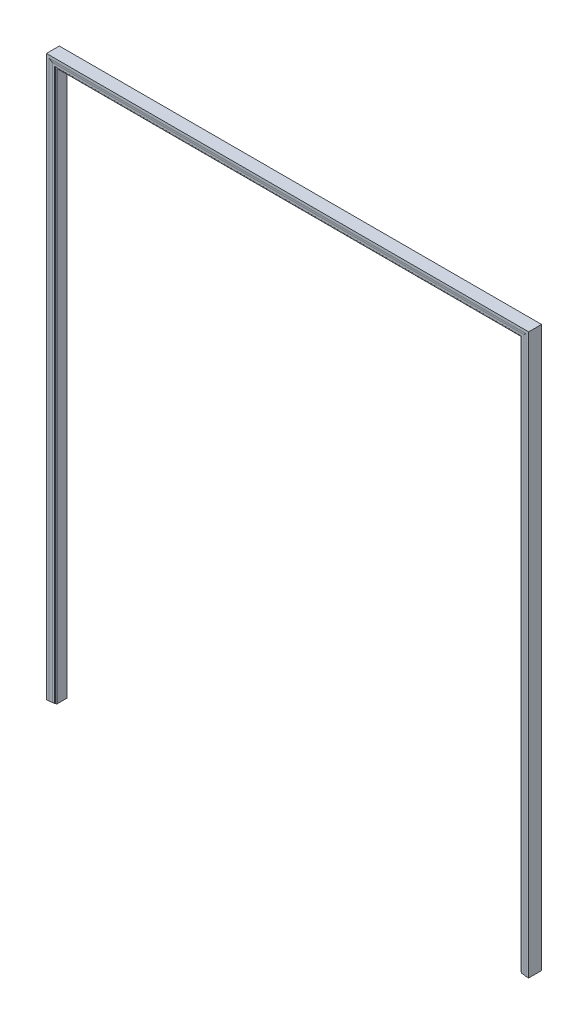
ISO-10303-21;
HEADER;
FILE_DESCRIPTION(('STEP AP214'),'2;1');
FILE_NAME('part.step','',(''),(''),'','','');
FILE_SCHEMA(('AUTOMOTIVE_DESIGN { 1 0 10303 214 1 1 1 1 }'));
ENDSEC;
DATA;
#1=APPLICATION_CONTEXT('core data for automotive mechanical design processes');
#2=APPLICATION_PROTOCOL_DEFINITION('international standard','automotive_design',2000,#1);
#3=PRODUCT_CONTEXT('',#1,'mechanical');
#4=PRODUCT('Part','Part','',(#3));
#5=PRODUCT_RELATED_PRODUCT_CATEGORY('part','',(#4));
#6=PRODUCT_DEFINITION_FORMATION('','',#4);
#7=PRODUCT_DEFINITION_CONTEXT('part definition',#1,'design');
#8=PRODUCT_DEFINITION('design','',#6,#7);
#9=PRODUCT_DEFINITION_SHAPE('','',#8);
#10=(LENGTH_UNIT() NAMED_UNIT(*) SI_UNIT(.MILLI.,.METRE.));
#11=(NAMED_UNIT(*) PLANE_ANGLE_UNIT() SI_UNIT($,.RADIAN.));
#12=(NAMED_UNIT(*) SI_UNIT($,.STERADIAN.) SOLID_ANGLE_UNIT());
#13=UNCERTAINTY_MEASURE_WITH_UNIT(LENGTH_MEASURE(1.E-05),#10,'distance_accuracy_value','');
#14=(GEOMETRIC_REPRESENTATION_CONTEXT(3) GLOBAL_UNCERTAINTY_ASSIGNED_CONTEXT((#13)) GLOBAL_UNIT_ASSIGNED_CONTEXT((#10,
#11,#12)) REPRESENTATION_CONTEXT('',''));
#15=CARTESIAN_POINT('',(0.,0.,0.));
#16=DIRECTION('',(0.,0.,1.));
#17=DIRECTION('',(1.,0.,0.));
#18=AXIS2_PLACEMENT_3D('',#15,#16,#17);
#19=CARTESIAN_POINT('',(0.,0.,-25.));
#20=DIRECTION('',(0.,0.,1.));
#21=DIRECTION('',(1.,0.,0.));
#22=AXIS2_PLACEMENT_3D('',#19,#20,#21);
#23=PLANE('',#22);
#24=DIRECTION('',(0.,1.,0.));
#25=VECTOR('',#24,1.);
#26=CARTESIAN_POINT('',(935.,-1102.5,-25.));
#27=LINE('',#26,#25);
#28=CARTESIAN_POINT('',(935.,-1067.5,-25.));
#29=VERTEX_POINT('',#28);
#30=CARTESIAN_POINT('',(935.,1102.5,-25.));
#31=VERTEX_POINT('',#30);
#32=EDGE_CURVE('E238',#29,#31,#27,.T.);
#33=ORIENTED_EDGE('',*,*,#32,.F.);
#34=DIRECTION('',(1.,0.,0.));
#35=VECTOR('',#34,1.);
#36=CARTESIAN_POINT('',(-935.,-1067.5,-25.));
#37=LINE('',#36,#35);
#38=CARTESIAN_POINT('',(924.5,-1067.5,-25.));
#39=VERTEX_POINT('',#38);
#40=EDGE_CURVE('E224',#39,#29,#37,.T.);
#41=ORIENTED_EDGE('',*,*,#40,.F.);
#42=DIRECTION('',(0.,1.,0.));
#43=VECTOR('',#42,1.);
#44=CARTESIAN_POINT('',(924.5,1080.,-25.));
#45=LINE('',#44,#43);
#46=CARTESIAN_POINT('',(924.5,1092.,-25.));
#47=VERTEX_POINT('',#46);
#48=EDGE_CURVE('E331',#39,#47,#45,.T.);
#49=ORIENTED_EDGE('',*,*,#48,.T.);
#50=DIRECTION('',(-1.,0.,0.));
#51=VECTOR('',#50,1.);
#52=CARTESIAN_POINT('',(-912.5,1092.,-25.));
#53=LINE('',#52,#51);
#54=CARTESIAN_POINT('',(-924.5,1092.,-25.));
#55=VERTEX_POINT('',#54);
#56=EDGE_CURVE('E333',#47,#55,#53,.T.);
#57=ORIENTED_EDGE('',*,*,#56,.T.);
#58=DIRECTION('',(0.,-1.,0.));
#59=VECTOR('',#58,1.);
#60=CARTESIAN_POINT('',(-924.5,-1080.,-25.));
#61=LINE('',#60,#59);
#62=CARTESIAN_POINT('',(-924.5,-1067.5,-25.));
#63=VERTEX_POINT('',#62);
#64=EDGE_CURVE('E320',#55,#63,#61,.T.);
#65=ORIENTED_EDGE('',*,*,#64,.T.);
#66=CARTESIAN_POINT('',(-935.,-1067.5,-25.));
#67=VERTEX_POINT('',#66);
#68=EDGE_CURVE('E64',#67,#63,#37,.T.);
#69=ORIENTED_EDGE('',*,*,#68,.F.);
#70=DIRECTION('',(0.,-1.,0.));
#71=VECTOR('',#70,1.);
#72=CARTESIAN_POINT('',(-935.,-1102.5,-25.));
#73=LINE('',#72,#71);
#74=CARTESIAN_POINT('',(-935.,1102.5,-25.));
#75=VERTEX_POINT('',#74);
#76=EDGE_CURVE('E248',#75,#67,#73,.T.);
#77=ORIENTED_EDGE('',*,*,#76,.F.);
#78=DIRECTION('',(-1.,0.,0.));
#79=VECTOR('',#78,1.);
#80=CARTESIAN_POINT('',(-935.,1102.5,-25.));
#81=LINE('',#80,#79);
#82=EDGE_CURVE('E245',#31,#75,#81,.T.);
#83=ORIENTED_EDGE('',*,*,#82,.F.);
#84=EDGE_LOOP('',(#33,#41,#49,#57,#65,#69,#77,#83));
#85=FACE_BOUND('',#84,.T.);
#86=ADVANCED_FACE('F41',(#85),#23,.F.);
#87=CARTESIAN_POINT('',(-905.,1072.5,-20.));
#88=DIRECTION('',(1.,0.,0.));
#89=DIRECTION('',(0.,0.,-1.));
#90=AXIS2_PLACEMENT_3D('',#87,#88,#89);
#91=PLANE('',#90);
#92=DIRECTION('',(0.,0.,1.));
#93=VECTOR('',#92,1.);
#94=CARTESIAN_POINT('',(-905.,-1067.5,-20.));
#95=LINE('',#94,#93);
#96=CARTESIAN_POINT('',(-905.,-1067.5,-22.));
#97=VERTEX_POINT('',#96);
#98=CARTESIAN_POINT('',(-905.,-1067.5,-20.));
#99=VERTEX_POINT('',#98);
#100=EDGE_CURVE('E451',#97,#99,#95,.T.);
#101=ORIENTED_EDGE('',*,*,#100,.F.);
#102=DIRECTION('',(0.,1.,0.));
#103=VECTOR('',#102,1.);
#104=CARTESIAN_POINT('',(-905.,1072.5,-22.));
#105=LINE('',#104,#103);
#106=CARTESIAN_POINT('',(-905.,1072.5,-22.));
#107=VERTEX_POINT('',#106);
#108=EDGE_CURVE('E302',#97,#107,#105,.T.);
#109=ORIENTED_EDGE('',*,*,#108,.T.);
#110=DIRECTION('',(0.,0.,-1.));
#111=VECTOR('',#110,1.);
#112=CARTESIAN_POINT('',(-905.,1072.5,-20.));
#113=LINE('',#112,#111);
#114=CARTESIAN_POINT('',(-905.,1072.5,-20.));
#115=VERTEX_POINT('',#114);
#116=EDGE_CURVE('E413',#115,#107,#113,.T.);
#117=ORIENTED_EDGE('',*,*,#116,.F.);
#118=DIRECTION('',(0.,-1.,0.));
#119=VECTOR('',#118,1.);
#120=CARTESIAN_POINT('',(-905.,1072.5,-20.));
#121=LINE('',#120,#119);
#122=EDGE_CURVE('E328',#115,#99,#121,.T.);
#123=ORIENTED_EDGE('',*,*,#122,.T.);
#124=EDGE_LOOP('',(#101,#109,#117,#123));
#125=FACE_BOUND('',#124,.T.);
#126=ADVANCED_FACE('F541',(#125),#91,.T.);
#127=CARTESIAN_POINT('',(905.,-1072.5,-20.));
#128=DIRECTION('',(-1.,0.,0.));
#129=DIRECTION('',(0.,0.,1.));
#130=AXIS2_PLACEMENT_3D('',#127,#128,#129);
#131=PLANE('',#130);
#132=DIRECTION('',(0.,0.,-1.));
#133=VECTOR('',#132,1.);
#134=CARTESIAN_POINT('',(905.,-1067.5,-20.));
#135=LINE('',#134,#133);
#136=CARTESIAN_POINT('',(905.,-1067.5,-20.));
#137=VERTEX_POINT('',#136);
#138=CARTESIAN_POINT('',(905.,-1067.5,-22.));
#139=VERTEX_POINT('',#138);
#140=EDGE_CURVE('E433',#137,#139,#135,.T.);
#141=ORIENTED_EDGE('',*,*,#140,.F.);
#142=DIRECTION('',(0.,1.,0.));
#143=VECTOR('',#142,1.);
#144=CARTESIAN_POINT('',(905.,-1072.5,-20.));
#145=LINE('',#144,#143);
#146=CARTESIAN_POINT('',(905.,1072.5,-20.));
#147=VERTEX_POINT('',#146);
#148=EDGE_CURVE('E416',#137,#147,#145,.T.);
#149=ORIENTED_EDGE('',*,*,#148,.T.);
#150=DIRECTION('',(0.,0.,-1.));
#151=VECTOR('',#150,1.);
#152=CARTESIAN_POINT('',(905.,1072.5,-20.));
#153=LINE('',#152,#151);
#154=CARTESIAN_POINT('',(905.,1072.5,-22.));
#155=VERTEX_POINT('',#154);
#156=EDGE_CURVE('E412',#147,#155,#153,.T.);
#157=ORIENTED_EDGE('',*,*,#156,.T.);
#158=DIRECTION('',(0.,-1.,0.));
#159=VECTOR('',#158,1.);
#160=CARTESIAN_POINT('',(905.,-1072.5,-22.));
#161=LINE('',#160,#159);
#162=EDGE_CURVE('E315',#155,#139,#161,.T.);
#163=ORIENTED_EDGE('',*,*,#162,.T.);
#164=EDGE_LOOP('',(#141,#149,#157,#163));
#165=FACE_BOUND('',#164,.T.);
#166=ADVANCED_FACE('F547',(#165),#131,.T.);
#167=CARTESIAN_POINT('',(905.,1072.5,-20.));
#168=DIRECTION('',(0.,-1.,0.));
#169=DIRECTION('',(0.,0.,-1.));
#170=AXIS2_PLACEMENT_3D('',#167,#168,#169);
#171=PLANE('',#170);
#172=ORIENTED_EDGE('',*,*,#116,.T.);
#173=DIRECTION('',(1.,0.,0.));
#174=VECTOR('',#173,1.);
#175=CARTESIAN_POINT('',(905.,1072.5,-22.));
#176=LINE('',#175,#174);
#177=EDGE_CURVE('E318',#107,#155,#176,.T.);
#178=ORIENTED_EDGE('',*,*,#177,.T.);
#179=ORIENTED_EDGE('',*,*,#156,.F.);
#180=DIRECTION('',(-1.,0.,0.));
#181=VECTOR('',#180,1.);
#182=CARTESIAN_POINT('',(905.,1072.5,-20.));
#183=LINE('',#182,#181);
#184=EDGE_CURVE('E420',#147,#115,#183,.T.);
#185=ORIENTED_EDGE('',*,*,#184,.T.);
#186=EDGE_LOOP('',(#172,#178,#179,#185));
#187=FACE_BOUND('',#186,.T.);
#188=ADVANCED_FACE('F704',(#187),#171,.T.);
#189=CARTESIAN_POINT('',(900.,-1067.5,25.));
#190=DIRECTION('',(-1.,0.,0.));
#191=DIRECTION('',(0.,0.,1.));
#192=AXIS2_PLACEMENT_3D('',#189,#190,#191);
#193=PLANE('',#192);
#194=DIRECTION('',(0.,0.,-1.));
#195=VECTOR('',#194,1.);
#196=CARTESIAN_POINT('',(900.,1067.5,25.));
#197=LINE('',#196,#195);
#198=CARTESIAN_POINT('',(900.,1067.5,20.));
#199=VERTEX_POINT('',#198);
#200=CARTESIAN_POINT('',(900.,1067.5,-20.));
#201=VERTEX_POINT('',#200);
#202=EDGE_CURVE('E246',#199,#201,#197,.T.);
#203=ORIENTED_EDGE('',*,*,#202,.T.);
#204=DIRECTION('',(0.,-1.,0.));
#205=VECTOR('',#204,1.);
#206=CARTESIAN_POINT('',(900.,-1067.5,-20.));
#207=LINE('',#206,#205);
#208=CARTESIAN_POINT('',(900.,-1067.5,-20.));
#209=VERTEX_POINT('',#208);
#210=EDGE_CURVE('E305',#201,#209,#207,.T.);
#211=ORIENTED_EDGE('',*,*,#210,.T.);
#212=DIRECTION('',(0.,0.,-1.));
#213=VECTOR('',#212,1.);
#214=CARTESIAN_POINT('',(900.,-1067.5,25.));
#215=LINE('',#214,#213);
#216=CARTESIAN_POINT('',(900.,-1067.5,20.));
#217=VERTEX_POINT('',#216);
#218=EDGE_CURVE('E380',#217,#209,#215,.T.);
#219=ORIENTED_EDGE('',*,*,#218,.F.);
#220=DIRECTION('',(0.,1.,0.));
#221=VECTOR('',#220,1.);
#222=CARTESIAN_POINT('',(900.,-1067.5,20.));
#223=LINE('',#222,#221);
#224=EDGE_CURVE('E382',#217,#199,#223,.T.);
#225=ORIENTED_EDGE('',*,*,#224,.T.);
#226=EDGE_LOOP('',(#203,#211,#219,#225));
#227=FACE_BOUND('',#226,.T.);
#228=ADVANCED_FACE('F505',(#227),#193,.T.);
#229=CARTESIAN_POINT('',(-900.,1067.5,25.));
#230=DIRECTION('',(0.,-1.,0.));
#231=DIRECTION('',(0.,0.,-1.));
#232=AXIS2_PLACEMENT_3D('',#229,#230,#231);
#233=PLANE('',#232);
#234=DIRECTION('',(0.,0.,-1.));
#235=VECTOR('',#234,1.);
#236=CARTESIAN_POINT('',(-900.,1067.5,25.));
#237=LINE('',#236,#235);
#238=CARTESIAN_POINT('',(-900.,1067.5,20.));
#239=VERTEX_POINT('',#238);
#240=CARTESIAN_POINT('',(-900.,1067.5,-20.));
#241=VERTEX_POINT('',#240);
#242=EDGE_CURVE('E251',#239,#241,#237,.T.);
#243=ORIENTED_EDGE('',*,*,#242,.T.);
#244=DIRECTION('',(1.,0.,0.));
#245=VECTOR('',#244,1.);
#246=CARTESIAN_POINT('',(-900.,1067.5,-20.));
#247=LINE('',#246,#245);
#248=EDGE_CURVE('E406',#241,#201,#247,.T.);
#249=ORIENTED_EDGE('',*,*,#248,.T.);
#250=ORIENTED_EDGE('',*,*,#202,.F.);
#251=DIRECTION('',(-1.,0.,0.));
#252=VECTOR('',#251,1.);
#253=CARTESIAN_POINT('',(-900.,1067.5,20.));
#254=LINE('',#253,#252);
#255=EDGE_CURVE('E385',#199,#239,#254,.T.);
#256=ORIENTED_EDGE('',*,*,#255,.T.);
#257=EDGE_LOOP('',(#243,#249,#250,#256));
#258=FACE_BOUND('',#257,.T.);
#259=ADVANCED_FACE('F508',(#258),#233,.T.);
#260=CARTESIAN_POINT('',(-900.,-1067.5,25.));
#261=DIRECTION('',(1.,0.,0.));
#262=DIRECTION('',(0.,0.,-1.));
#263=AXIS2_PLACEMENT_3D('',#260,#261,#262);
#264=PLANE('',#263);
#265=DIRECTION('',(0.,0.,-1.));
#266=VECTOR('',#265,1.);
#267=CARTESIAN_POINT('',(-900.,-1067.5,25.));
#268=LINE('',#267,#266);
#269=CARTESIAN_POINT('',(-900.,-1067.5,20.));
#270=VERTEX_POINT('',#269);
#271=CARTESIAN_POINT('',(-900.,-1067.5,-20.));
#272=VERTEX_POINT('',#271);
#273=EDGE_CURVE('E377',#270,#272,#268,.T.);
#274=ORIENTED_EDGE('',*,*,#273,.T.);
#275=DIRECTION('',(0.,1.,0.));
#276=VECTOR('',#275,1.);
#277=CARTESIAN_POINT('',(-900.,-1067.5,-20.));
#278=LINE('',#277,#276);
#279=EDGE_CURVE('E409',#272,#241,#278,.T.);
#280=ORIENTED_EDGE('',*,*,#279,.T.);
#281=ORIENTED_EDGE('',*,*,#242,.F.);
#282=DIRECTION('',(0.,-1.,0.));
#283=VECTOR('',#282,1.);
#284=CARTESIAN_POINT('',(-900.,-1067.5,20.));
#285=LINE('',#284,#283);
#286=EDGE_CURVE('E388',#239,#270,#285,.T.);
#287=ORIENTED_EDGE('',*,*,#286,.T.);
#288=EDGE_LOOP('',(#274,#280,#281,#287));
#289=FACE_BOUND('',#288,.T.);
#290=ADVANCED_FACE('F512',(#289),#264,.T.);
#291=CARTESIAN_POINT('',(-905.,1072.5,20.));
#292=DIRECTION('',(-1.,0.,0.));
#293=DIRECTION('',(0.,0.,1.));
#294=AXIS2_PLACEMENT_3D('',#291,#292,#293);
#295=PLANE('',#294);
#296=DIRECTION('',(0.,1.,0.));
#297=VECTOR('',#296,1.);
#298=CARTESIAN_POINT('',(-905.,-1072.5,22.));
#299=LINE('',#298,#297);
#300=CARTESIAN_POINT('',(-905.,1072.5,22.));
#301=VERTEX_POINT('',#300);
#302=CARTESIAN_POINT('',(-905.,-1067.5,22.));
#303=VERTEX_POINT('',#302);
#304=EDGE_CURVE('E275',#301,#303,#299,.F.);
#305=ORIENTED_EDGE('',*,*,#304,.T.);
#306=DIRECTION('',(0.,0.,-1.));
#307=VECTOR('',#306,1.);
#308=CARTESIAN_POINT('',(-905.,-1067.5,20.));
#309=LINE('',#308,#307);
#310=CARTESIAN_POINT('',(-905.,-1067.5,20.));
#311=VERTEX_POINT('',#310);
#312=EDGE_CURVE('E444',#303,#311,#309,.T.);
#313=ORIENTED_EDGE('',*,*,#312,.T.);
#314=DIRECTION('',(0.,-1.,0.));
#315=VECTOR('',#314,1.);
#316=CARTESIAN_POINT('',(-905.,1072.5,20.));
#317=LINE('',#316,#315);
#318=CARTESIAN_POINT('',(-905.,1072.5,20.));
#319=VERTEX_POINT('',#318);
#320=EDGE_CURVE('E286',#319,#311,#317,.T.);
#321=ORIENTED_EDGE('',*,*,#320,.F.);
#322=DIRECTION('',(0.,0.,1.));
#323=VECTOR('',#322,1.);
#324=CARTESIAN_POINT('',(-905.,1072.5,20.));
#325=LINE('',#324,#323);
#326=EDGE_CURVE('E391',#319,#301,#325,.T.);
#327=ORIENTED_EDGE('',*,*,#326,.T.);
#328=EDGE_LOOP('',(#305,#313,#321,#327));
#329=FACE_BOUND('',#328,.T.);
#330=ADVANCED_FACE('F516',(#329),#295,.F.);
#331=CARTESIAN_POINT('',(905.,1072.5,20.));
#332=DIRECTION('',(0.,1.,0.));
#333=DIRECTION('',(0.,0.,1.));
#334=AXIS2_PLACEMENT_3D('',#331,#332,#333);
#335=PLANE('',#334);
#336=DIRECTION('',(0.,0.,1.));
#337=VECTOR('',#336,1.);
#338=CARTESIAN_POINT('',(905.,1072.5,20.));
#339=LINE('',#338,#337);
#340=CARTESIAN_POINT('',(905.,1072.5,20.));
#341=VERTEX_POINT('',#340);
#342=CARTESIAN_POINT('',(905.,1072.5,22.));
#343=VERTEX_POINT('',#342);
#344=EDGE_CURVE('E392',#341,#343,#339,.T.);
#345=ORIENTED_EDGE('',*,*,#344,.T.);
#346=DIRECTION('',(1.,0.,0.));
#347=VECTOR('',#346,1.);
#348=CARTESIAN_POINT('',(-905.,1072.5,22.));
#349=LINE('',#348,#347);
#350=EDGE_CURVE('E273',#343,#301,#349,.F.);
#351=ORIENTED_EDGE('',*,*,#350,.T.);
#352=ORIENTED_EDGE('',*,*,#326,.F.);
#353=DIRECTION('',(-1.,0.,0.));
#354=VECTOR('',#353,1.);
#355=CARTESIAN_POINT('',(905.,1072.5,20.));
#356=LINE('',#355,#354);
#357=EDGE_CURVE('E395',#341,#319,#356,.T.);
#358=ORIENTED_EDGE('',*,*,#357,.F.);
#359=EDGE_LOOP('',(#345,#351,#352,#358));
#360=FACE_BOUND('',#359,.T.);
#361=ADVANCED_FACE('F528',(#360),#335,.F.);
#362=CARTESIAN_POINT('',(905.,-1072.5,20.));
#363=DIRECTION('',(1.,0.,0.));
#364=DIRECTION('',(0.,0.,-1.));
#365=AXIS2_PLACEMENT_3D('',#362,#363,#364);
#366=PLANE('',#365);
#367=DIRECTION('',(0.,1.,0.));
#368=VECTOR('',#367,1.);
#369=CARTESIAN_POINT('',(905.,-1072.5,20.));
#370=LINE('',#369,#368);
#371=CARTESIAN_POINT('',(905.,-1067.5,20.));
#372=VERTEX_POINT('',#371);
#373=EDGE_CURVE('E400',#372,#341,#370,.T.);
#374=ORIENTED_EDGE('',*,*,#373,.F.);
#375=DIRECTION('',(0.,0.,1.));
#376=VECTOR('',#375,1.);
#377=CARTESIAN_POINT('',(905.,-1067.5,20.));
#378=LINE('',#377,#376);
#379=CARTESIAN_POINT('',(905.,-1067.5,22.));
#380=VERTEX_POINT('',#379);
#381=EDGE_CURVE('E424',#372,#380,#378,.T.);
#382=ORIENTED_EDGE('',*,*,#381,.T.);
#383=DIRECTION('',(0.,-1.,0.));
#384=VECTOR('',#383,1.);
#385=CARTESIAN_POINT('',(905.,1072.5,22.));
#386=LINE('',#385,#384);
#387=EDGE_CURVE('E271',#380,#343,#386,.F.);
#388=ORIENTED_EDGE('',*,*,#387,.T.);
#389=ORIENTED_EDGE('',*,*,#344,.F.);
#390=EDGE_LOOP('',(#374,#382,#388,#389));
#391=FACE_BOUND('',#390,.T.);
#392=ADVANCED_FACE('F490',(#391),#366,.F.);
#393=CARTESIAN_POINT('',(0.,0.,25.));
#394=DIRECTION('',(0.,0.,1.));
#395=DIRECTION('',(1.,0.,0.));
#396=AXIS2_PLACEMENT_3D('',#393,#394,#395);
#397=PLANE('',#396);
#398=DIRECTION('',(-1.,0.,0.));
#399=VECTOR('',#398,1.);
#400=CARTESIAN_POINT('',(-935.,-1067.5,25.));
#401=LINE('',#400,#399);
#402=CARTESIAN_POINT('',(935.,-1067.5,25.));
#403=VERTEX_POINT('',#402);
#404=CARTESIAN_POINT('',(924.5,-1067.5,25.));
#405=VERTEX_POINT('',#404);
#406=EDGE_CURVE('E456',#403,#405,#401,.T.);
#407=ORIENTED_EDGE('',*,*,#406,.F.);
#408=DIRECTION('',(0.,1.,0.));
#409=VECTOR('',#408,1.);
#410=CARTESIAN_POINT('',(935.,-1102.5,25.));
#411=LINE('',#410,#409);
#412=CARTESIAN_POINT('',(935.,1102.5,25.));
#413=VERTEX_POINT('',#412);
#414=EDGE_CURVE('E240',#403,#413,#411,.T.);
#415=ORIENTED_EDGE('',*,*,#414,.T.);
#416=DIRECTION('',(-1.,0.,0.));
#417=VECTOR('',#416,1.);
#418=CARTESIAN_POINT('',(-935.,1102.5,25.));
#419=LINE('',#418,#417);
#420=CARTESIAN_POINT('',(-935.,1102.5,25.));
#421=VERTEX_POINT('',#420);
#422=EDGE_CURVE('E371',#413,#421,#419,.T.);
#423=ORIENTED_EDGE('',*,*,#422,.T.);
#424=DIRECTION('',(0.,-1.,0.));
#425=VECTOR('',#424,1.);
#426=CARTESIAN_POINT('',(-935.,-1102.5,25.));
#427=LINE('',#426,#425);
#428=CARTESIAN_POINT('',(-935.,-1067.5,25.));
#429=VERTEX_POINT('',#428);
#430=EDGE_CURVE('E254',#421,#429,#427,.T.);
#431=ORIENTED_EDGE('',*,*,#430,.T.);
#432=CARTESIAN_POINT('',(-924.5,-1067.5,25.));
#433=VERTEX_POINT('',#432);
#434=EDGE_CURVE('E241',#433,#429,#401,.T.);
#435=ORIENTED_EDGE('',*,*,#434,.F.);
#436=DIRECTION('',(0.,1.,0.));
#437=VECTOR('',#436,1.);
#438=CARTESIAN_POINT('',(-924.5,1080.,25.));
#439=LINE('',#438,#437);
#440=CARTESIAN_POINT('',(-924.5,1092.,25.));
#441=VERTEX_POINT('',#440);
#442=EDGE_CURVE('E278',#433,#441,#439,.T.);
#443=ORIENTED_EDGE('',*,*,#442,.T.);
#444=DIRECTION('',(1.,0.,0.));
#445=VECTOR('',#444,1.);
#446=CARTESIAN_POINT('',(912.5,1092.,25.));
#447=LINE('',#446,#445);
#448=CARTESIAN_POINT('',(924.5,1092.,25.));
#449=VERTEX_POINT('',#448);
#450=EDGE_CURVE('E291',#441,#449,#447,.T.);
#451=ORIENTED_EDGE('',*,*,#450,.T.);
#452=DIRECTION('',(0.,-1.,0.));
#453=VECTOR('',#452,1.);
#454=CARTESIAN_POINT('',(924.5,-1080.,25.));
#455=LINE('',#454,#453);
#456=EDGE_CURVE('E288',#449,#405,#455,.T.);
#457=ORIENTED_EDGE('',*,*,#456,.T.);
#458=EDGE_LOOP('',(#407,#415,#423,#431,#435,#443,#451,#457));
#459=FACE_BOUND('',#458,.T.);
#460=ADVANCED_FACE('F462',(#459),#397,.T.);
#461=CARTESIAN_POINT('',(935.,-1102.5,25.));
#462=DIRECTION('',(-1.,0.,0.));
#463=DIRECTION('',(0.,0.,1.));
#464=AXIS2_PLACEMENT_3D('',#461,#462,#463);
#465=PLANE('',#464);
#466=ORIENTED_EDGE('',*,*,#414,.F.);
#467=DIRECTION('',(0.,0.,1.));
#468=VECTOR('',#467,1.);
#469=CARTESIAN_POINT('',(935.,-1067.5,25.));
#470=LINE('',#469,#468);
#471=EDGE_CURVE('E227',#29,#403,#470,.T.);
#472=ORIENTED_EDGE('',*,*,#471,.F.);
#473=ORIENTED_EDGE('',*,*,#32,.T.);
#474=DIRECTION('',(0.,0.,-1.));
#475=VECTOR('',#474,1.);
#476=CARTESIAN_POINT('',(935.,1102.5,25.));
#477=LINE('',#476,#475);
#478=EDGE_CURVE('E262',#413,#31,#477,.T.);
#479=ORIENTED_EDGE('',*,*,#478,.F.);
#480=EDGE_LOOP('',(#466,#472,#473,#479));
#481=FACE_BOUND('',#480,.T.);
#482=ADVANCED_FACE('F236',(#481),#465,.F.);
#483=CARTESIAN_POINT('',(-935.,1102.5,25.));
#484=DIRECTION('',(0.,-1.,0.));
#485=DIRECTION('',(0.,0.,-1.));
#486=AXIS2_PLACEMENT_3D('',#483,#484,#485);
#487=PLANE('',#486);
#488=ORIENTED_EDGE('',*,*,#82,.T.);
#489=DIRECTION('',(0.,0.,-1.));
#490=VECTOR('',#489,1.);
#491=CARTESIAN_POINT('',(-935.,1102.5,25.));
#492=LINE('',#491,#490);
#493=EDGE_CURVE('E259',#421,#75,#492,.T.);
#494=ORIENTED_EDGE('',*,*,#493,.F.);
#495=ORIENTED_EDGE('',*,*,#422,.F.);
#496=ORIENTED_EDGE('',*,*,#478,.T.);
#497=EDGE_LOOP('',(#488,#494,#495,#496));
#498=FACE_BOUND('',#497,.T.);
#499=ADVANCED_FACE('F370',(#498),#487,.F.);
#500=CARTESIAN_POINT('',(-935.,-1102.5,25.));
#501=DIRECTION('',(1.,0.,0.));
#502=DIRECTION('',(0.,0.,-1.));
#503=AXIS2_PLACEMENT_3D('',#500,#501,#502);
#504=PLANE('',#503);
#505=ORIENTED_EDGE('',*,*,#76,.T.);
#506=DIRECTION('',(0.,0.,-1.));
#507=VECTOR('',#506,1.);
#508=CARTESIAN_POINT('',(-935.,-1067.5,25.));
#509=LINE('',#508,#507);
#510=EDGE_CURVE('E365',#429,#67,#509,.T.);
#511=ORIENTED_EDGE('',*,*,#510,.F.);
#512=ORIENTED_EDGE('',*,*,#430,.F.);
#513=ORIENTED_EDGE('',*,*,#493,.T.);
#514=EDGE_LOOP('',(#505,#511,#512,#513));
#515=FACE_BOUND('',#514,.T.);
#516=ADVANCED_FACE('F363',(#515),#504,.F.);
#517=CARTESIAN_POINT('',(0.,0.,20.));
#518=DIRECTION('',(0.,0.,1.));
#519=DIRECTION('',(1.,0.,0.));
#520=AXIS2_PLACEMENT_3D('',#517,#518,#519);
#521=PLANE('',#520);
#522=DIRECTION('',(-1.,0.,0.));
#523=VECTOR('',#522,1.);
#524=CARTESIAN_POINT('',(0.,-1067.5,20.));
#525=LINE('',#524,#523);
#526=EDGE_CURVE('E344',#372,#217,#525,.T.);
#527=ORIENTED_EDGE('',*,*,#526,.F.);
#528=ORIENTED_EDGE('',*,*,#373,.T.);
#529=ORIENTED_EDGE('',*,*,#357,.T.);
#530=ORIENTED_EDGE('',*,*,#320,.T.);
#531=EDGE_CURVE('E447',#270,#311,#525,.T.);
#532=ORIENTED_EDGE('',*,*,#531,.F.);
#533=ORIENTED_EDGE('',*,*,#286,.F.);
#534=ORIENTED_EDGE('',*,*,#255,.F.);
#535=ORIENTED_EDGE('',*,*,#224,.F.);
#536=EDGE_LOOP('',(#527,#528,#529,#530,#532,#533,#534,#535));
#537=FACE_BOUND('',#536,.T.);
#538=ADVANCED_FACE('F494',(#537),#521,.T.);
#539=CARTESIAN_POINT('',(0.,0.,23.));
#540=DIRECTION('',(0.,0.,1.));
#541=DIRECTION('',(1.,0.,0.));
#542=AXIS2_PLACEMENT_3D('',#539,#540,#541);
#543=PLANE('',#542);
#544=DIRECTION('',(-1.,0.,0.));
#545=VECTOR('',#544,1.);
#546=CARTESIAN_POINT('',(0.,-1067.5,23.));
#547=LINE('',#546,#545);
#548=CARTESIAN_POINT('',(914.210891968059,-1067.5,22.9999999999999));
#549=VERTEX_POINT('',#548);
#550=CARTESIAN_POINT('',(906.,-1067.5,23.));
#551=VERTEX_POINT('',#550);
#552=EDGE_CURVE('E429',#549,#551,#547,.T.);
#553=ORIENTED_EDGE('',*,*,#552,.F.);
#554=DIRECTION('',(0.,1.,0.));
#555=VECTOR('',#554,1.);
#556=CARTESIAN_POINT('',(914.21089196806,-1080.,23.));
#557=LINE('',#556,#555);
#558=CARTESIAN_POINT('',(914.210891968059,1081.71089196806,23.));
#559=VERTEX_POINT('',#558);
#560=EDGE_CURVE('E297',#549,#559,#557,.T.);
#561=ORIENTED_EDGE('',*,*,#560,.T.);
#562=DIRECTION('',(-1.,0.,0.));
#563=VECTOR('',#562,1.);
#564=CARTESIAN_POINT('',(912.5,1081.71089196806,23.));
#565=LINE('',#564,#563);
#566=CARTESIAN_POINT('',(-914.21089196806,1081.71089196806,23.));
#567=VERTEX_POINT('',#566);
#568=EDGE_CURVE('E294',#559,#567,#565,.T.);
#569=ORIENTED_EDGE('',*,*,#568,.T.);
#570=DIRECTION('',(0.,-1.,0.));
#571=VECTOR('',#570,1.);
#572=CARTESIAN_POINT('',(-914.21089196806,1080.,23.));
#573=LINE('',#572,#571);
#574=CARTESIAN_POINT('',(-914.21089196806,-1067.5,23.));
#575=VERTEX_POINT('',#574);
#576=EDGE_CURVE('E299',#567,#575,#573,.T.);
#577=ORIENTED_EDGE('',*,*,#576,.T.);
#578=CARTESIAN_POINT('',(-906.,-1067.5,23.));
#579=VERTEX_POINT('',#578);
#580=EDGE_CURVE('E440',#579,#575,#547,.T.);
#581=ORIENTED_EDGE('',*,*,#580,.F.);
#582=DIRECTION('',(0.,1.,0.));
#583=VECTOR('',#582,1.);
#584=CARTESIAN_POINT('',(-906.,1072.5,23.));
#585=LINE('',#584,#583);
#586=CARTESIAN_POINT('',(-906.,1073.5,23.));
#587=VERTEX_POINT('',#586);
#588=EDGE_CURVE('E264',#579,#587,#585,.T.);
#589=ORIENTED_EDGE('',*,*,#588,.T.);
#590=DIRECTION('',(1.,0.,0.));
#591=VECTOR('',#590,1.);
#592=CARTESIAN_POINT('',(905.,1073.5,23.));
#593=LINE('',#592,#591);
#594=CARTESIAN_POINT('',(906.,1073.5,23.));
#595=VERTEX_POINT('',#594);
#596=EDGE_CURVE('E266',#587,#595,#593,.T.);
#597=ORIENTED_EDGE('',*,*,#596,.T.);
#598=DIRECTION('',(0.,-1.,0.));
#599=VECTOR('',#598,1.);
#600=CARTESIAN_POINT('',(906.,-1072.5,23.));
#601=LINE('',#600,#599);
#602=EDGE_CURVE('E268',#595,#551,#601,.T.);
#603=ORIENTED_EDGE('',*,*,#602,.T.);
#604=EDGE_LOOP('',(#553,#561,#569,#577,#581,#589,#597,#603));
#605=FACE_BOUND('',#604,.T.);
#606=ADVANCED_FACE('F480',(#605),#543,.T.);
#607=CARTESIAN_POINT('',(0.,1073.5,22.));
#608=DIRECTION('',(-1.,0.,0.));
#609=DIRECTION('',(0.,0.,1.));
#610=AXIS2_PLACEMENT_3D('',#607,#608,#609);
#611=CYLINDRICAL_SURFACE('',#610,1.);
#612=CARTESIAN_POINT('',(-906.,1073.5,22.));
#613=DIRECTION('',(-0.707106781186547,-0.707106781186547,0.));
#614=DIRECTION('',(-0.707106781186547,0.707106781186547,0.));
#615=AXIS2_PLACEMENT_3D('',#612,#613,#614);
#616=ELLIPSE('',#615,1.41421356237309,1.);
#617=EDGE_CURVE('E279',#301,#587,#616,.T.);
#618=ORIENTED_EDGE('',*,*,#617,.F.);
#619=ORIENTED_EDGE('',*,*,#350,.F.);
#620=CARTESIAN_POINT('',(906.,1073.5,22.));
#621=DIRECTION('',(-0.707106781186547,0.707106781186547,0.));
#622=DIRECTION('',(0.707106781186547,0.707106781186547,0.));
#623=AXIS2_PLACEMENT_3D('',#620,#621,#622);
#624=ELLIPSE('',#623,1.41421356237309,1.);
#625=EDGE_CURVE('E282',#595,#343,#624,.F.);
#626=ORIENTED_EDGE('',*,*,#625,.F.);
#627=ORIENTED_EDGE('',*,*,#596,.F.);
#628=EDGE_LOOP('',(#618,#619,#626,#627));
#629=FACE_BOUND('',#628,.T.);
#630=ADVANCED_FACE('F525',(#629),#611,.T.);
#631=CARTESIAN_POINT('',(906.,0.,22.));
#632=DIRECTION('',(0.,1.,0.));
#633=DIRECTION('',(0.,0.,1.));
#634=AXIS2_PLACEMENT_3D('',#631,#632,#633);
#635=CYLINDRICAL_SURFACE('',#634,1.);
#636=CARTESIAN_POINT('',(906.,-1067.5,22.));
#637=DIRECTION('',(0.,1.,0.));
#638=DIRECTION('',(0.,0.,1.));
#639=AXIS2_PLACEMENT_3D('',#636,#637,#638);
#640=CIRCLE('',#639,1.);
#641=EDGE_CURVE('E427',#551,#380,#640,.F.);
#642=ORIENTED_EDGE('',*,*,#641,.F.);
#643=ORIENTED_EDGE('',*,*,#602,.F.);
#644=ORIENTED_EDGE('',*,*,#625,.T.);
#645=ORIENTED_EDGE('',*,*,#387,.F.);
#646=EDGE_LOOP('',(#642,#643,#644,#645));
#647=FACE_BOUND('',#646,.T.);
#648=ADVANCED_FACE('F485',(#647),#635,.T.);
#649=CARTESIAN_POINT('',(-906.,0.,22.));
#650=DIRECTION('',(0.,-1.,0.));
#651=DIRECTION('',(0.,0.,-1.));
#652=AXIS2_PLACEMENT_3D('',#649,#650,#651);
#653=CYLINDRICAL_SURFACE('',#652,1.);
#654=CARTESIAN_POINT('',(-906.,-1067.5,22.));
#655=DIRECTION('',(0.,1.,0.));
#656=DIRECTION('',(0.,0.,1.));
#657=AXIS2_PLACEMENT_3D('',#654,#655,#656);
#658=CIRCLE('',#657,1.);
#659=EDGE_CURVE('E442',#303,#579,#658,.F.);
#660=ORIENTED_EDGE('',*,*,#659,.F.);
#661=ORIENTED_EDGE('',*,*,#304,.F.);
#662=ORIENTED_EDGE('',*,*,#617,.T.);
#663=ORIENTED_EDGE('',*,*,#588,.F.);
#664=EDGE_LOOP('',(#660,#661,#662,#663));
#665=FACE_BOUND('',#664,.T.);
#666=ADVANCED_FACE('F523',(#665),#653,.T.);
#667=CARTESIAN_POINT('',(912.5,-1080.,22.6674362903473));
#668=DIRECTION('',(-0.190808995376553,0.,0.981627183447663));
#669=DIRECTION('',(0.,-1.,0.));
#670=AXIS2_PLACEMENT_3D('',#667,#668,#669);
#671=PLANE('',#670);
#672=DIRECTION('',(-0.981627183447662,0.,-0.190808995376552));
#673=VECTOR('',#672,1.);
#674=CARTESIAN_POINT('',(912.5,-1067.5,22.6674362903473));
#675=LINE('',#674,#673);
#676=EDGE_CURVE('E430',#405,#549,#675,.T.);
#677=ORIENTED_EDGE('',*,*,#676,.F.);
#678=ORIENTED_EDGE('',*,*,#456,.F.);
#679=DIRECTION('',(0.700520675022719,0.700520675022719,0.136167425368285));
#680=VECTOR('',#679,1.);
#681=CARTESIAN_POINT('',(-147.475106850058,20.024893149942,-183.370852657462));
#682=LINE('',#681,#680);
#683=EDGE_CURVE('E283',#559,#449,#682,.T.);
#684=ORIENTED_EDGE('',*,*,#683,.F.);
#685=ORIENTED_EDGE('',*,*,#560,.F.);
#686=EDGE_LOOP('',(#677,#678,#684,#685));
#687=FACE_BOUND('',#686,.T.);
#688=ADVANCED_FACE('F475',(#687),#671,.T.);
#689=CARTESIAN_POINT('',(-912.5,1080.,22.6674362903473));
#690=DIRECTION('',(0.190808995376553,0.,0.981627183447663));
#691=DIRECTION('',(0.,1.,0.));
#692=AXIS2_PLACEMENT_3D('',#689,#690,#691);
#693=PLANE('',#692);
#694=DIRECTION('',(-0.981627183447662,0.,0.190808995376552));
#695=VECTOR('',#694,1.);
#696=CARTESIAN_POINT('',(-912.5,-1067.5,22.6674362903473));
#697=LINE('',#696,#695);
#698=EDGE_CURVE('E438',#575,#433,#697,.T.);
#699=ORIENTED_EDGE('',*,*,#698,.F.);
#700=ORIENTED_EDGE('',*,*,#576,.F.);
#701=DIRECTION('',(0.700520675022719,-0.700520675022719,-0.136167425368285));
#702=VECTOR('',#701,1.);
#703=CARTESIAN_POINT('',(-912.5,1080.,22.6674362903473));
#704=LINE('',#703,#702);
#705=EDGE_CURVE('E303',#441,#567,#704,.T.);
#706=ORIENTED_EDGE('',*,*,#705,.F.);
#707=ORIENTED_EDGE('',*,*,#442,.F.);
#708=EDGE_LOOP('',(#699,#700,#706,#707));
#709=FACE_BOUND('',#708,.T.);
#710=ADVANCED_FACE('F466',(#709),#693,.T.);
#711=CARTESIAN_POINT('',(912.5,1080.,22.6674362903473));
#712=DIRECTION('',(0.,-0.190808995376553,0.981627183447663));
#713=DIRECTION('',(1.,0.,0.));
#714=AXIS2_PLACEMENT_3D('',#711,#712,#713);
#715=PLANE('',#714);
#716=ORIENTED_EDGE('',*,*,#683,.T.);
#717=ORIENTED_EDGE('',*,*,#450,.F.);
#718=ORIENTED_EDGE('',*,*,#705,.T.);
#719=ORIENTED_EDGE('',*,*,#568,.F.);
#720=EDGE_LOOP('',(#716,#717,#718,#719));
#721=FACE_BOUND('',#720,.T.);
#722=ADVANCED_FACE('F470',(#721),#715,.T.);
#723=CARTESIAN_POINT('',(0.,0.,-20.));
#724=DIRECTION('',(0.,0.,-1.));
#725=DIRECTION('',(1.,0.,0.));
#726=AXIS2_PLACEMENT_3D('',#723,#724,#725);
#727=PLANE('',#726);
#728=DIRECTION('',(1.,0.,0.));
#729=VECTOR('',#728,1.);
#730=CARTESIAN_POINT('',(0.,-1067.5,-20.));
#731=LINE('',#730,#729);
#732=EDGE_CURVE('E449',#99,#272,#731,.T.);
#733=ORIENTED_EDGE('',*,*,#732,.F.);
#734=ORIENTED_EDGE('',*,*,#122,.F.);
#735=ORIENTED_EDGE('',*,*,#184,.F.);
#736=ORIENTED_EDGE('',*,*,#148,.F.);
#737=EDGE_CURVE('E432',#209,#137,#731,.T.);
#738=ORIENTED_EDGE('',*,*,#737,.F.);
#739=ORIENTED_EDGE('',*,*,#210,.F.);
#740=ORIENTED_EDGE('',*,*,#248,.F.);
#741=ORIENTED_EDGE('',*,*,#279,.F.);
#742=EDGE_LOOP('',(#733,#734,#735,#736,#738,#739,#740,#741));
#743=FACE_BOUND('',#742,.T.);
#744=ADVANCED_FACE('F503',(#743),#727,.T.);
#745=CARTESIAN_POINT('',(0.,0.,-23.));
#746=DIRECTION('',(0.,0.,-1.));
#747=DIRECTION('',(1.,0.,0.));
#748=AXIS2_PLACEMENT_3D('',#745,#746,#747);
#749=PLANE('',#748);
#750=DIRECTION('',(1.,0.,0.));
#751=VECTOR('',#750,1.);
#752=CARTESIAN_POINT('',(0.,-1067.5,-23.));
#753=LINE('',#752,#751);
#754=CARTESIAN_POINT('',(-914.21089196806,-1067.5,-23.));
#755=VERTEX_POINT('',#754);
#756=CARTESIAN_POINT('',(-906.,-1067.5,-23.));
#757=VERTEX_POINT('',#756);
#758=EDGE_CURVE('E357',#755,#757,#753,.T.);
#759=ORIENTED_EDGE('',*,*,#758,.F.);
#760=DIRECTION('',(0.,1.,0.));
#761=VECTOR('',#760,1.);
#762=CARTESIAN_POINT('',(-914.21089196806,0.,-23.));
#763=LINE('',#762,#761);
#764=CARTESIAN_POINT('',(-914.21089196806,1081.71089196806,-23.));
#765=VERTEX_POINT('',#764);
#766=EDGE_CURVE('E50',#755,#765,#763,.T.);
#767=ORIENTED_EDGE('',*,*,#766,.T.);
#768=DIRECTION('',(1.,0.,0.));
#769=VECTOR('',#768,1.);
#770=CARTESIAN_POINT('',(0.,1081.71089196806,-23.));
#771=LINE('',#770,#769);
#772=CARTESIAN_POINT('',(914.21089196806,1081.71089196806,-23.));
#773=VERTEX_POINT('',#772);
#774=EDGE_CURVE('E336',#765,#773,#771,.T.);
#775=ORIENTED_EDGE('',*,*,#774,.T.);
#776=DIRECTION('',(0.,-1.,0.));
#777=VECTOR('',#776,1.);
#778=CARTESIAN_POINT('',(914.21089196806,0.,-23.));
#779=LINE('',#778,#777);
#780=CARTESIAN_POINT('',(914.21089196806,-1067.5,-23.));
#781=VERTEX_POINT('',#780);
#782=EDGE_CURVE('E339',#773,#781,#779,.T.);
#783=ORIENTED_EDGE('',*,*,#782,.T.);
#784=CARTESIAN_POINT('',(906.,-1067.5,-23.));
#785=VERTEX_POINT('',#784);
#786=EDGE_CURVE('E57',#785,#781,#753,.T.);
#787=ORIENTED_EDGE('',*,*,#786,.F.);
#788=DIRECTION('',(0.,-1.,0.));
#789=VECTOR('',#788,1.);
#790=CARTESIAN_POINT('',(906.,0.,-23.));
#791=LINE('',#790,#789);
#792=CARTESIAN_POINT('',(906.,1073.5,-23.));
#793=VERTEX_POINT('',#792);
#794=EDGE_CURVE('E310',#785,#793,#791,.F.);
#795=ORIENTED_EDGE('',*,*,#794,.T.);
#796=DIRECTION('',(1.,0.,0.));
#797=VECTOR('',#796,1.);
#798=CARTESIAN_POINT('',(0.,1073.5,-23.));
#799=LINE('',#798,#797);
#800=CARTESIAN_POINT('',(-906.,1073.5,-23.));
#801=VERTEX_POINT('',#800);
#802=EDGE_CURVE('E308',#793,#801,#799,.F.);
#803=ORIENTED_EDGE('',*,*,#802,.T.);
#804=DIRECTION('',(0.,1.,0.));
#805=VECTOR('',#804,1.);
#806=CARTESIAN_POINT('',(-906.,0.,-23.));
#807=LINE('',#806,#805);
#808=EDGE_CURVE('E312',#801,#757,#807,.F.);
#809=ORIENTED_EDGE('',*,*,#808,.T.);
#810=EDGE_LOOP('',(#759,#767,#775,#783,#787,#795,#803,#809));
#811=FACE_BOUND('',#810,.T.);
#812=ADVANCED_FACE('F355',(#811),#749,.T.);
#813=CARTESIAN_POINT('',(906.,-1072.5,-22.));
#814=DIRECTION('',(0.,-1.,0.));
#815=DIRECTION('',(0.,0.,-1.));
#816=AXIS2_PLACEMENT_3D('',#813,#814,#815);
#817=CYLINDRICAL_SURFACE('',#816,1.);
#818=CARTESIAN_POINT('',(906.,-1067.5,-22.));
#819=DIRECTION('',(0.,1.,0.));
#820=DIRECTION('',(0.,0.,1.));
#821=AXIS2_PLACEMENT_3D('',#818,#819,#820);
#822=CIRCLE('',#821,1.);
#823=EDGE_CURVE('E435',#139,#785,#822,.F.);
#824=ORIENTED_EDGE('',*,*,#823,.F.);
#825=ORIENTED_EDGE('',*,*,#162,.F.);
#826=CARTESIAN_POINT('',(906.,1073.5,-22.));
#827=DIRECTION('',(0.707106781186547,-0.707106781186547,0.));
#828=DIRECTION('',(-0.707106781186547,-0.707106781186547,0.));
#829=AXIS2_PLACEMENT_3D('',#826,#827,#828);
#830=ELLIPSE('',#829,1.41421356237309,1.);
#831=EDGE_CURVE('E324',#793,#155,#830,.F.);
#832=ORIENTED_EDGE('',*,*,#831,.F.);
#833=ORIENTED_EDGE('',*,*,#794,.F.);
#834=EDGE_LOOP('',(#824,#825,#832,#833));
#835=FACE_BOUND('',#834,.T.);
#836=ADVANCED_FACE('F585',(#835),#817,.T.);
#837=CARTESIAN_POINT('',(905.,1073.5,-22.));
#838=DIRECTION('',(1.,0.,0.));
#839=DIRECTION('',(0.,0.,-1.));
#840=AXIS2_PLACEMENT_3D('',#837,#838,#839);
#841=CYLINDRICAL_SURFACE('',#840,1.);
#842=ORIENTED_EDGE('',*,*,#831,.T.);
#843=ORIENTED_EDGE('',*,*,#177,.F.);
#844=CARTESIAN_POINT('',(-906.,1073.5,-22.));
#845=DIRECTION('',(0.707106781186547,0.707106781186547,0.));
#846=DIRECTION('',(-0.707106781186547,0.707106781186547,0.));
#847=AXIS2_PLACEMENT_3D('',#844,#845,#846);
#848=ELLIPSE('',#847,1.41421356237309,1.);
#849=EDGE_CURVE('E321',#801,#107,#848,.F.);
#850=ORIENTED_EDGE('',*,*,#849,.F.);
#851=ORIENTED_EDGE('',*,*,#802,.F.);
#852=EDGE_LOOP('',(#842,#843,#850,#851));
#853=FACE_BOUND('',#852,.T.);
#854=ADVANCED_FACE('F581',(#853),#841,.T.);
#855=CARTESIAN_POINT('',(-906.,1072.5,-22.));
#856=DIRECTION('',(0.,1.,0.));
#857=DIRECTION('',(0.,0.,1.));
#858=AXIS2_PLACEMENT_3D('',#855,#856,#857);
#859=CYLINDRICAL_SURFACE('',#858,1.);
#860=CARTESIAN_POINT('',(-906.,-1067.5,-22.));
#861=DIRECTION('',(0.,1.,0.));
#862=DIRECTION('',(0.,0.,1.));
#863=AXIS2_PLACEMENT_3D('',#860,#861,#862);
#864=CIRCLE('',#863,1.);
#865=EDGE_CURVE('E453',#757,#97,#864,.F.);
#866=ORIENTED_EDGE('',*,*,#865,.F.);
#867=ORIENTED_EDGE('',*,*,#808,.F.);
#868=ORIENTED_EDGE('',*,*,#849,.T.);
#869=ORIENTED_EDGE('',*,*,#108,.F.);
#870=EDGE_LOOP('',(#866,#867,#868,#869));
#871=FACE_BOUND('',#870,.T.);
#872=ADVANCED_FACE('F578',(#871),#859,.T.);
#873=CARTESIAN_POINT('',(924.5,0.,-25.));
#874=DIRECTION('',(-0.190808995376553,0.,-0.981627183447663));
#875=DIRECTION('',(0.,-1.,0.));
#876=AXIS2_PLACEMENT_3D('',#873,#874,#875);
#877=PLANE('',#876);
#878=DIRECTION('',(0.981627183447662,0.,-0.190808995376552));
#879=VECTOR('',#878,1.);
#880=CARTESIAN_POINT('',(924.5,-1067.5,-25.));
#881=LINE('',#880,#879);
#882=EDGE_CURVE('E229',#781,#39,#881,.T.);
#883=ORIENTED_EDGE('',*,*,#882,.F.);
#884=ORIENTED_EDGE('',*,*,#782,.F.);
#885=DIRECTION('',(-0.700520675022719,-0.700520675022719,0.136167425368285));
#886=VECTOR('',#885,1.);
#887=CARTESIAN_POINT('',(388.62369598136,556.123695981359,79.1638016347257));
#888=LINE('',#887,#886);
#889=EDGE_CURVE('E325',#47,#773,#888,.T.);
#890=ORIENTED_EDGE('',*,*,#889,.F.);
#891=ORIENTED_EDGE('',*,*,#48,.F.);
#892=EDGE_LOOP('',(#883,#884,#890,#891));
#893=FACE_BOUND('',#892,.T.);
#894=ADVANCED_FACE('F44',(#893),#877,.T.);
#895=CARTESIAN_POINT('',(-924.5,0.,-25.));
#896=DIRECTION('',(0.190808995376553,0.,-0.981627183447663));
#897=DIRECTION('',(0.,1.,0.));
#898=AXIS2_PLACEMENT_3D('',#895,#896,#897);
#899=PLANE('',#898);
#900=DIRECTION('',(0.981627183447662,0.,0.190808995376552));
#901=VECTOR('',#900,1.);
#902=CARTESIAN_POINT('',(-924.5,-1067.5,-25.));
#903=LINE('',#902,#901);
#904=EDGE_CURVE('E11',#63,#755,#903,.T.);
#905=ORIENTED_EDGE('',*,*,#904,.F.);
#906=ORIENTED_EDGE('',*,*,#64,.F.);
#907=DIRECTION('',(-0.700520675022719,0.700520675022719,-0.136167425368285));
#908=VECTOR('',#907,1.);
#909=CARTESIAN_POINT('',(-388.623695981359,556.123695981359,79.1638016347257));
#910=LINE('',#909,#908);
#911=EDGE_CURVE('E343',#765,#55,#910,.T.);
#912=ORIENTED_EDGE('',*,*,#911,.F.);
#913=ORIENTED_EDGE('',*,*,#766,.F.);
#914=EDGE_LOOP('',(#905,#906,#912,#913));
#915=FACE_BOUND('',#914,.T.);
#916=ADVANCED_FACE('F359',(#915),#899,.T.);
#917=CARTESIAN_POINT('',(0.,1092.,-25.));
#918=DIRECTION('',(0.,-0.190808995376553,-0.981627183447663));
#919=DIRECTION('',(1.,0.,0.));
#920=AXIS2_PLACEMENT_3D('',#917,#918,#919);
#921=PLANE('',#920);
#922=ORIENTED_EDGE('',*,*,#889,.T.);
#923=ORIENTED_EDGE('',*,*,#774,.F.);
#924=ORIENTED_EDGE('',*,*,#911,.T.);
#925=ORIENTED_EDGE('',*,*,#56,.F.);
#926=EDGE_LOOP('',(#922,#923,#924,#925));
#927=FACE_BOUND('',#926,.T.);
#928=ADVANCED_FACE('F350',(#927),#921,.T.);
#929=CARTESIAN_POINT('',(-900.,-1067.5,25.));
#930=DIRECTION('',(0.,1.,0.));
#931=DIRECTION('',(0.,0.,1.));
#932=AXIS2_PLACEMENT_3D('',#929,#930,#931);
#933=PLANE('',#932);
#934=ORIENTED_EDGE('',*,*,#698,.T.);
#935=ORIENTED_EDGE('',*,*,#434,.T.);
#936=ORIENTED_EDGE('',*,*,#510,.T.);
#937=ORIENTED_EDGE('',*,*,#68,.T.);
#938=ORIENTED_EDGE('',*,*,#904,.T.);
#939=ORIENTED_EDGE('',*,*,#758,.T.);
#940=ORIENTED_EDGE('',*,*,#865,.T.);
#941=ORIENTED_EDGE('',*,*,#100,.T.);
#942=ORIENTED_EDGE('',*,*,#732,.T.);
#943=ORIENTED_EDGE('',*,*,#273,.F.);
#944=ORIENTED_EDGE('',*,*,#531,.T.);
#945=ORIENTED_EDGE('',*,*,#312,.F.);
#946=ORIENTED_EDGE('',*,*,#659,.T.);
#947=ORIENTED_EDGE('',*,*,#580,.T.);
#948=EDGE_LOOP('',(#934,#935,#936,#937,#938,#939,#940,#941,#942,#943,#944,#945,#946,#947));
#949=FACE_BOUND('',#948,.T.);
#950=ADVANCED_FACE('F458',(#949),#933,.F.);
#951=ORIENTED_EDGE('',*,*,#218,.T.);
#952=ORIENTED_EDGE('',*,*,#737,.T.);
#953=ORIENTED_EDGE('',*,*,#140,.T.);
#954=ORIENTED_EDGE('',*,*,#823,.T.);
#955=ORIENTED_EDGE('',*,*,#786,.T.);
#956=ORIENTED_EDGE('',*,*,#882,.T.);
#957=ORIENTED_EDGE('',*,*,#40,.T.);
#958=ORIENTED_EDGE('',*,*,#471,.T.);
#959=ORIENTED_EDGE('',*,*,#406,.T.);
#960=ORIENTED_EDGE('',*,*,#676,.T.);
#961=ORIENTED_EDGE('',*,*,#552,.T.);
#962=ORIENTED_EDGE('',*,*,#641,.T.);
#963=ORIENTED_EDGE('',*,*,#381,.F.);
#964=ORIENTED_EDGE('',*,*,#526,.T.);
#965=EDGE_LOOP('',(#951,#952,#953,#954,#955,#956,#957,#958,#959,#960,#961,#962,#963,#964));
#966=FACE_BOUND('',#965,.T.);
#967=ADVANCED_FACE('F226',(#966),#933,.F.);
#968=CLOSED_SHELL('',(#86,#126,#166,#188,#228,#259,#290,#330,#361,#392,#460,#482,#499,#516,#538,
#606,#630,#648,#666,#688,#710,#722,#744,#812,#836,#854,#872,#894,#916,#928,#950,#967));
#969=MANIFOLD_SOLID_BREP('B2',#968);
#970=ADVANCED_BREP_SHAPE_REPRESENTATION('',(#18,#969),#14);
#971=SHAPE_DEFINITION_REPRESENTATION(#9,#970);
ENDSEC;
END-ISO-10303-21;
